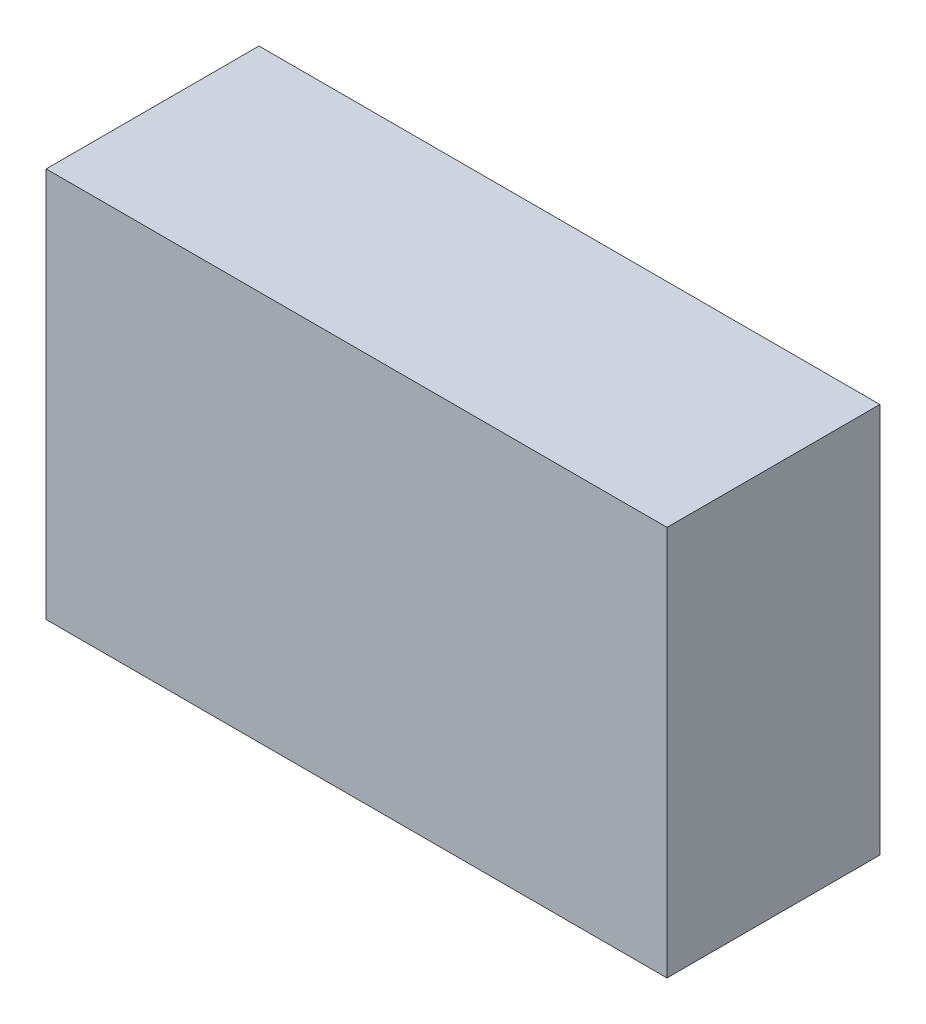
ISO-10303-21;
HEADER;
FILE_DESCRIPTION(('STEP AP214'),'2;1');
FILE_NAME('part.step','',(''),(''),'','','');
FILE_SCHEMA(('AUTOMOTIVE_DESIGN { 1 0 10303 214 1 1 1 1 }'));
ENDSEC;
DATA;
#1=APPLICATION_CONTEXT('core data for automotive mechanical design processes');
#2=APPLICATION_PROTOCOL_DEFINITION('international standard','automotive_design',2000,#1);
#3=PRODUCT_CONTEXT('',#1,'mechanical');
#4=PRODUCT('Part','Part','',(#3));
#5=PRODUCT_RELATED_PRODUCT_CATEGORY('part','',(#4));
#6=PRODUCT_DEFINITION_FORMATION('','',#4);
#7=PRODUCT_DEFINITION_CONTEXT('part definition',#1,'design');
#8=PRODUCT_DEFINITION('design','',#6,#7);
#9=PRODUCT_DEFINITION_SHAPE('','',#8);
#10=(LENGTH_UNIT() NAMED_UNIT(*) SI_UNIT(.MILLI.,.METRE.));
#11=(NAMED_UNIT(*) PLANE_ANGLE_UNIT() SI_UNIT($,.RADIAN.));
#12=(NAMED_UNIT(*) SI_UNIT($,.STERADIAN.) SOLID_ANGLE_UNIT());
#13=UNCERTAINTY_MEASURE_WITH_UNIT(LENGTH_MEASURE(1.E-05),#10,'distance_accuracy_value','');
#14=(GEOMETRIC_REPRESENTATION_CONTEXT(3) GLOBAL_UNCERTAINTY_ASSIGNED_CONTEXT((#13)) GLOBAL_UNIT_ASSIGNED_CONTEXT((#10,
#11,#12)) REPRESENTATION_CONTEXT('',''));
#15=CARTESIAN_POINT('',(0.,0.,0.));
#16=DIRECTION('',(0.,0.,1.));
#17=DIRECTION('',(1.,0.,0.));
#18=AXIS2_PLACEMENT_3D('',#15,#16,#17);
#19=CARTESIAN_POINT('',(17.5,11.,12.));
#20=DIRECTION('',(-1.,0.,0.));
#21=DIRECTION('',(0.,0.,1.));
#22=AXIS2_PLACEMENT_3D('',#19,#20,#21);
#23=PLANE('',#22);
#24=DIRECTION('',(0.,1.,0.));
#25=VECTOR('',#24,1.);
#26=CARTESIAN_POINT('',(17.5,11.,0.));
#27=LINE('',#26,#25);
#28=CARTESIAN_POINT('',(17.5,-11.,0.));
#29=VERTEX_POINT('',#28);
#30=CARTESIAN_POINT('',(17.5,11.,0.));
#31=VERTEX_POINT('',#30);
#32=EDGE_CURVE('E102',#29,#31,#27,.T.);
#33=ORIENTED_EDGE('',*,*,#32,.T.);
#34=DIRECTION('',(0.,0.,-1.));
#35=VECTOR('',#34,1.);
#36=CARTESIAN_POINT('',(17.5,11.,12.));
#37=LINE('',#36,#35);
#38=CARTESIAN_POINT('',(17.5,11.,12.));
#39=VERTEX_POINT('',#38);
#40=EDGE_CURVE('E11',#39,#31,#37,.T.);
#41=ORIENTED_EDGE('',*,*,#40,.F.);
#42=DIRECTION('',(0.,1.,0.));
#43=VECTOR('',#42,1.);
#44=CARTESIAN_POINT('',(17.5,11.,12.));
#45=LINE('',#44,#43);
#46=CARTESIAN_POINT('',(17.5,-11.,12.));
#47=VERTEX_POINT('',#46);
#48=EDGE_CURVE('E90',#47,#39,#45,.T.);
#49=ORIENTED_EDGE('',*,*,#48,.F.);
#50=DIRECTION('',(0.,0.,-1.));
#51=VECTOR('',#50,1.);
#52=CARTESIAN_POINT('',(17.5,-11.,12.));
#53=LINE('',#52,#51);
#54=EDGE_CURVE('E98',#47,#29,#53,.T.);
#55=ORIENTED_EDGE('',*,*,#54,.T.);
#56=EDGE_LOOP('',(#33,#41,#49,#55));
#57=FACE_BOUND('',#56,.T.);
#58=ADVANCED_FACE('F39',(#57),#23,.F.);
#59=CARTESIAN_POINT('',(-17.5,11.,12.));
#60=DIRECTION('',(0.,-1.,0.));
#61=DIRECTION('',(0.,0.,-1.));
#62=AXIS2_PLACEMENT_3D('',#59,#60,#61);
#63=PLANE('',#62);
#64=DIRECTION('',(-1.,0.,0.));
#65=VECTOR('',#64,1.);
#66=CARTESIAN_POINT('',(-17.5,11.,0.));
#67=LINE('',#66,#65);
#68=CARTESIAN_POINT('',(-17.5,11.,0.));
#69=VERTEX_POINT('',#68);
#70=EDGE_CURVE('E94',#31,#69,#67,.T.);
#71=ORIENTED_EDGE('',*,*,#70,.T.);
#72=DIRECTION('',(0.,0.,-1.));
#73=VECTOR('',#72,1.);
#74=CARTESIAN_POINT('',(-17.5,11.,12.));
#75=LINE('',#74,#73);
#76=CARTESIAN_POINT('',(-17.5,11.,12.));
#77=VERTEX_POINT('',#76);
#78=EDGE_CURVE('E47',#77,#69,#75,.T.);
#79=ORIENTED_EDGE('',*,*,#78,.F.);
#80=DIRECTION('',(-1.,0.,0.));
#81=VECTOR('',#80,1.);
#82=CARTESIAN_POINT('',(-17.5,11.,12.));
#83=LINE('',#82,#81);
#84=EDGE_CURVE('E85',#39,#77,#83,.T.);
#85=ORIENTED_EDGE('',*,*,#84,.F.);
#86=ORIENTED_EDGE('',*,*,#40,.T.);
#87=EDGE_LOOP('',(#71,#79,#85,#86));
#88=FACE_BOUND('',#87,.T.);
#89=ADVANCED_FACE('F93',(#88),#63,.F.);
#90=CARTESIAN_POINT('',(-17.5,11.,12.));
#91=DIRECTION('',(1.,0.,0.));
#92=DIRECTION('',(0.,0.,-1.));
#93=AXIS2_PLACEMENT_3D('',#90,#91,#92);
#94=PLANE('',#93);
#95=DIRECTION('',(0.,-1.,0.));
#96=VECTOR('',#95,1.);
#97=CARTESIAN_POINT('',(-17.5,11.,0.));
#98=LINE('',#97,#96);
#99=CARTESIAN_POINT('',(-17.5,-11.,0.));
#100=VERTEX_POINT('',#99);
#101=EDGE_CURVE('E72',#69,#100,#98,.T.);
#102=ORIENTED_EDGE('',*,*,#101,.T.);
#103=DIRECTION('',(0.,0.,-1.));
#104=VECTOR('',#103,1.);
#105=CARTESIAN_POINT('',(-17.5,-11.,12.));
#106=LINE('',#105,#104);
#107=CARTESIAN_POINT('',(-17.5,-11.,12.));
#108=VERTEX_POINT('',#107);
#109=EDGE_CURVE('E95',#108,#100,#106,.T.);
#110=ORIENTED_EDGE('',*,*,#109,.F.);
#111=DIRECTION('',(0.,-1.,0.));
#112=VECTOR('',#111,1.);
#113=CARTESIAN_POINT('',(-17.5,11.,12.));
#114=LINE('',#113,#112);
#115=EDGE_CURVE('E88',#77,#108,#114,.T.);
#116=ORIENTED_EDGE('',*,*,#115,.F.);
#117=ORIENTED_EDGE('',*,*,#78,.T.);
#118=EDGE_LOOP('',(#102,#110,#116,#117));
#119=FACE_BOUND('',#118,.T.);
#120=ADVANCED_FACE('F96',(#119),#94,.F.);
#121=CARTESIAN_POINT('',(-17.5,-11.,12.));
#122=DIRECTION('',(0.,1.,0.));
#123=DIRECTION('',(0.,0.,1.));
#124=AXIS2_PLACEMENT_3D('',#121,#122,#123);
#125=PLANE('',#124);
#126=DIRECTION('',(1.,0.,0.));
#127=VECTOR('',#126,1.);
#128=CARTESIAN_POINT('',(-17.5,-11.,0.));
#129=LINE('',#128,#127);
#130=EDGE_CURVE('E78',#100,#29,#129,.T.);
#131=ORIENTED_EDGE('',*,*,#130,.T.);
#132=ORIENTED_EDGE('',*,*,#54,.F.);
#133=DIRECTION('',(1.,0.,0.));
#134=VECTOR('',#133,1.);
#135=CARTESIAN_POINT('',(-17.5,-11.,12.));
#136=LINE('',#135,#134);
#137=EDGE_CURVE('E55',#108,#47,#136,.T.);
#138=ORIENTED_EDGE('',*,*,#137,.F.);
#139=ORIENTED_EDGE('',*,*,#109,.T.);
#140=EDGE_LOOP('',(#131,#132,#138,#139));
#141=FACE_BOUND('',#140,.T.);
#142=ADVANCED_FACE('F109',(#141),#125,.F.);
#143=CARTESIAN_POINT('',(0.,0.,12.));
#144=DIRECTION('',(0.,0.,1.));
#145=DIRECTION('',(1.,0.,0.));
#146=AXIS2_PLACEMENT_3D('',#143,#144,#145);
#147=PLANE('',#146);
#148=ORIENTED_EDGE('',*,*,#48,.T.);
#149=ORIENTED_EDGE('',*,*,#84,.T.);
#150=ORIENTED_EDGE('',*,*,#115,.T.);
#151=ORIENTED_EDGE('',*,*,#137,.T.);
#152=EDGE_LOOP('',(#148,#149,#150,#151));
#153=FACE_BOUND('',#152,.T.);
#154=ADVANCED_FACE('F86',(#153),#147,.T.);
#155=CARTESIAN_POINT('',(0.,0.,0.));
#156=DIRECTION('',(0.,0.,1.));
#157=DIRECTION('',(1.,0.,0.));
#158=AXIS2_PLACEMENT_3D('',#155,#156,#157);
#159=PLANE('',#158);
#160=ORIENTED_EDGE('',*,*,#32,.F.);
#161=ORIENTED_EDGE('',*,*,#130,.F.);
#162=ORIENTED_EDGE('',*,*,#101,.F.);
#163=ORIENTED_EDGE('',*,*,#70,.F.);
#164=EDGE_LOOP('',(#160,#161,#162,#163));
#165=FACE_BOUND('',#164,.T.);
#166=ADVANCED_FACE('F112',(#165),#159,.F.);
#167=CLOSED_SHELL('',(#58,#89,#120,#142,#154,#166));
#168=MANIFOLD_SOLID_BREP('B2',#167);
#169=ADVANCED_BREP_SHAPE_REPRESENTATION('',(#18,#168),#14);
#170=SHAPE_DEFINITION_REPRESENTATION(#9,#169);
ENDSEC;
END-ISO-10303-21;
